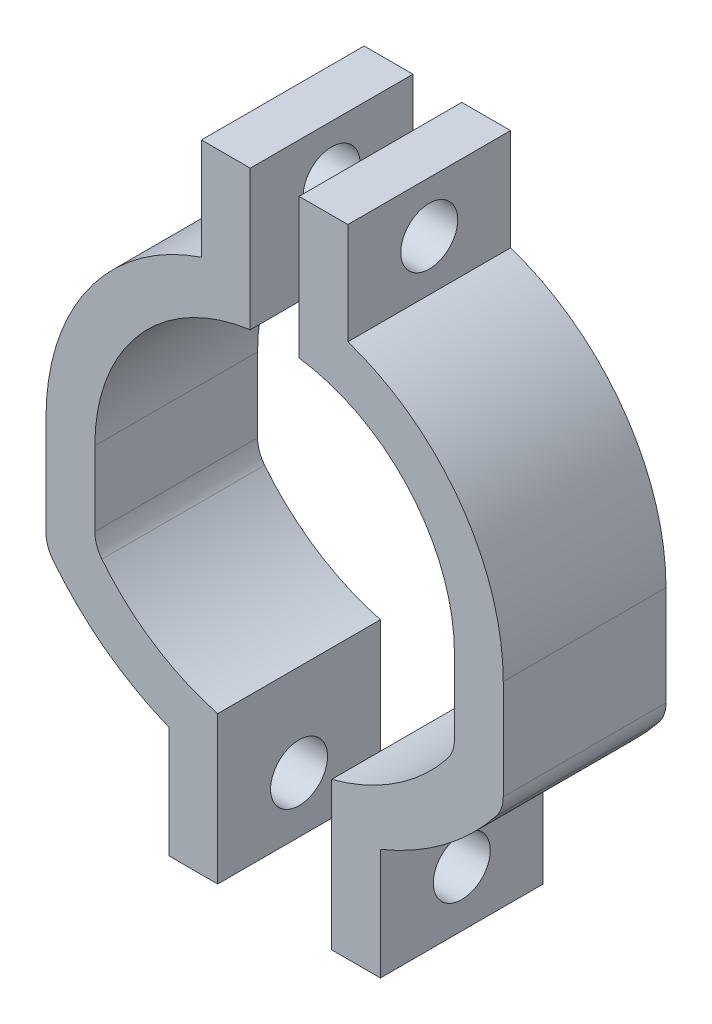
ISO-10303-21;
HEADER;
FILE_DESCRIPTION(('STEP AP214'),'2;1');
FILE_NAME('part.step','',(''),(''),'','','');
FILE_SCHEMA(('AUTOMOTIVE_DESIGN { 1 0 10303 214 1 1 1 1 }'));
ENDSEC;
DATA;
#1=APPLICATION_CONTEXT('core data for automotive mechanical design processes');
#2=APPLICATION_PROTOCOL_DEFINITION('international standard','automotive_design',2000,#1);
#3=PRODUCT_CONTEXT('',#1,'mechanical');
#4=PRODUCT('Part','Part','',(#3));
#5=PRODUCT_RELATED_PRODUCT_CATEGORY('part','',(#4));
#6=PRODUCT_DEFINITION_FORMATION('','',#4);
#7=PRODUCT_DEFINITION_CONTEXT('part definition',#1,'design');
#8=PRODUCT_DEFINITION('design','',#6,#7);
#9=PRODUCT_DEFINITION_SHAPE('','',#8);
#10=(LENGTH_UNIT() NAMED_UNIT(*) SI_UNIT(.MILLI.,.METRE.));
#11=(NAMED_UNIT(*) PLANE_ANGLE_UNIT() SI_UNIT($,.RADIAN.));
#12=(NAMED_UNIT(*) SI_UNIT($,.STERADIAN.) SOLID_ANGLE_UNIT());
#13=UNCERTAINTY_MEASURE_WITH_UNIT(LENGTH_MEASURE(1.E-05),#10,'distance_accuracy_value','');
#14=(GEOMETRIC_REPRESENTATION_CONTEXT(3) GLOBAL_UNCERTAINTY_ASSIGNED_CONTEXT((#13)) GLOBAL_UNIT_ASSIGNED_CONTEXT((#10,
#11,#12)) REPRESENTATION_CONTEXT('',''));
#15=CARTESIAN_POINT('',(0.,0.,0.));
#16=DIRECTION('',(0.,0.,1.));
#17=DIRECTION('',(1.,0.,0.));
#18=AXIS2_PLACEMENT_3D('',#15,#16,#17);
#19=CARTESIAN_POINT('',(0.,0.,10.));
#20=DIRECTION('',(0.,0.,-1.));
#21=DIRECTION('',(-1.,0.,0.));
#22=AXIS2_PLACEMENT_3D('',#19,#20,#21);
#23=CYLINDRICAL_SURFACE('',#22,14.05);
#24=CARTESIAN_POINT('',(0.,0.,0.));
#25=DIRECTION('',(0.,0.,1.));
#26=DIRECTION('',(1.,0.,0.));
#27=AXIS2_PLACEMENT_3D('',#24,#25,#26);
#28=CIRCLE('',#27,14.05);
#29=CARTESIAN_POINT('',(-4.5,13.3098647626488,0.));
#30=VERTEX_POINT('',#29);
#31=CARTESIAN_POINT('',(-14.05,0.,0.));
#32=VERTEX_POINT('',#31);
#33=EDGE_CURVE('E176',#30,#32,#28,.T.);
#34=ORIENTED_EDGE('',*,*,#33,.T.);
#35=DIRECTION('',(0.,0.,-1.));
#36=VECTOR('',#35,1.);
#37=CARTESIAN_POINT('',(-14.05,0.,10.));
#38=LINE('',#37,#36);
#39=CARTESIAN_POINT('',(-14.05,0.,10.));
#40=VERTEX_POINT('',#39);
#41=EDGE_CURVE('E12',#40,#32,#38,.T.);
#42=ORIENTED_EDGE('',*,*,#41,.F.);
#43=CARTESIAN_POINT('',(0.,0.,10.));
#44=DIRECTION('',(0.,0.,1.));
#45=DIRECTION('',(1.,0.,0.));
#46=AXIS2_PLACEMENT_3D('',#43,#44,#45);
#47=CIRCLE('',#46,14.05);
#48=CARTESIAN_POINT('',(-4.5,13.3098647626488,10.));
#49=VERTEX_POINT('',#48);
#50=EDGE_CURVE('E204',#49,#40,#47,.T.);
#51=ORIENTED_EDGE('',*,*,#50,.F.);
#52=DIRECTION('',(0.,0.,-1.));
#53=VECTOR('',#52,1.);
#54=CARTESIAN_POINT('',(-4.5,13.3098647626488,10.));
#55=LINE('',#54,#53);
#56=EDGE_CURVE('E172',#49,#30,#55,.T.);
#57=ORIENTED_EDGE('',*,*,#56,.T.);
#58=EDGE_LOOP('',(#34,#42,#51,#57));
#59=FACE_BOUND('',#58,.T.);
#60=ADVANCED_FACE('F43',(#59),#23,.T.);
#61=CARTESIAN_POINT('',(-14.05,0.,10.));
#62=DIRECTION('',(1.,0.,0.));
#63=DIRECTION('',(0.,0.,-1.));
#64=AXIS2_PLACEMENT_3D('',#61,#62,#63);
#65=PLANE('',#64);
#66=DIRECTION('',(0.,-1.,0.));
#67=VECTOR('',#66,1.);
#68=CARTESIAN_POINT('',(-14.05,0.,0.));
#69=LINE('',#68,#67);
#70=CARTESIAN_POINT('',(-14.05,-6.13172007972729,0.));
#71=VERTEX_POINT('',#70);
#72=EDGE_CURVE('E179',#32,#71,#69,.T.);
#73=ORIENTED_EDGE('',*,*,#72,.T.);
#74=DIRECTION('',(0.,0.,-1.));
#75=VECTOR('',#74,1.);
#76=CARTESIAN_POINT('',(-14.05,-6.13172007972729,10.));
#77=LINE('',#76,#75);
#78=CARTESIAN_POINT('',(-14.05,-6.13172007972729,10.));
#79=VERTEX_POINT('',#78);
#80=EDGE_CURVE('E52',#79,#71,#77,.T.);
#81=ORIENTED_EDGE('',*,*,#80,.F.);
#82=DIRECTION('',(0.,-1.,0.));
#83=VECTOR('',#82,1.);
#84=CARTESIAN_POINT('',(-14.05,0.,10.));
#85=LINE('',#84,#83);
#86=EDGE_CURVE('E121',#40,#79,#85,.T.);
#87=ORIENTED_EDGE('',*,*,#86,.F.);
#88=ORIENTED_EDGE('',*,*,#41,.T.);
#89=EDGE_LOOP('',(#73,#81,#87,#88));
#90=FACE_BOUND('',#89,.T.);
#91=ADVANCED_FACE('F295',(#90),#65,.F.);
#92=CARTESIAN_POINT('',(-12.05,-6.13172007972729,10.));
#93=DIRECTION('',(0.,0.,-1.));
#94=DIRECTION('',(-1.,0.,0.));
#95=AXIS2_PLACEMENT_3D('',#92,#93,#94);
#96=CYLINDRICAL_SURFACE('',#95,2.);
#97=CARTESIAN_POINT('',(-12.05,-6.13172007972729,0.));
#98=DIRECTION('',(0.,0.,1.));
#99=DIRECTION('',(-1.,0.,0.));
#100=AXIS2_PLACEMENT_3D('',#97,#98,#99);
#101=CIRCLE('',#100,2.);
#102=CARTESIAN_POINT('',(-13.6184776271521,-7.3726382612056,0.));
#103=VERTEX_POINT('',#102);
#104=EDGE_CURVE('E182',#71,#103,#101,.T.);
#105=ORIENTED_EDGE('',*,*,#104,.T.);
#106=DIRECTION('',(0.,0.,-1.));
#107=VECTOR('',#106,1.);
#108=CARTESIAN_POINT('',(-13.6184776271521,-7.3726382612056,10.));
#109=LINE('',#108,#107);
#110=CARTESIAN_POINT('',(-13.6184776271521,-7.3726382612056,10.));
#111=VERTEX_POINT('',#110);
#112=EDGE_CURVE('E229',#111,#103,#109,.T.);
#113=ORIENTED_EDGE('',*,*,#112,.F.);
#114=CARTESIAN_POINT('',(-12.05,-6.13172007972729,10.));
#115=DIRECTION('',(0.,0.,1.));
#116=DIRECTION('',(-1.,0.,0.));
#117=AXIS2_PLACEMENT_3D('',#114,#115,#116);
#118=CIRCLE('',#117,2.);
#119=EDGE_CURVE('E238',#79,#111,#118,.T.);
#120=ORIENTED_EDGE('',*,*,#119,.F.);
#121=ORIENTED_EDGE('',*,*,#80,.T.);
#122=EDGE_LOOP('',(#105,#113,#120,#121));
#123=FACE_BOUND('',#122,.T.);
#124=ADVANCED_FACE('F236',(#123),#96,.T.);
#125=CARTESIAN_POINT('',(0.,3.40176884479405,10.));
#126=DIRECTION('',(0.,0.,-1.));
#127=DIRECTION('',(-1.,0.,0.));
#128=AXIS2_PLACEMENT_3D('',#125,#126,#127);
#129=CYLINDRICAL_SURFACE('',#128,17.3652175732715);
#130=CARTESIAN_POINT('',(0.,3.40176884479405,0.));
#131=DIRECTION('',(0.,0.,1.));
#132=DIRECTION('',(1.,0.,0.));
#133=AXIS2_PLACEMENT_3D('',#130,#131,#132);
#134=CIRCLE('',#133,17.3652175732715);
#135=CARTESIAN_POINT('',(-6.5,-12.7010502055169,0.));
#136=VERTEX_POINT('',#135);
#137=EDGE_CURVE('E184',#103,#136,#134,.T.);
#138=ORIENTED_EDGE('',*,*,#137,.T.);
#139=DIRECTION('',(0.,0.,-1.));
#140=VECTOR('',#139,1.);
#141=CARTESIAN_POINT('',(-6.5,-12.7010502055169,10.));
#142=LINE('',#141,#140);
#143=CARTESIAN_POINT('',(-6.5,-12.7010502055169,10.));
#144=VERTEX_POINT('',#143);
#145=EDGE_CURVE('E226',#144,#136,#142,.T.);
#146=ORIENTED_EDGE('',*,*,#145,.F.);
#147=CARTESIAN_POINT('',(0.,3.40176884479405,10.));
#148=DIRECTION('',(0.,0.,1.));
#149=DIRECTION('',(1.,0.,0.));
#150=AXIS2_PLACEMENT_3D('',#147,#148,#149);
#151=CIRCLE('',#150,17.3652175732715);
#152=EDGE_CURVE('E256',#111,#144,#151,.T.);
#153=ORIENTED_EDGE('',*,*,#152,.F.);
#154=ORIENTED_EDGE('',*,*,#112,.T.);
#155=EDGE_LOOP('',(#138,#146,#153,#154));
#156=FACE_BOUND('',#155,.T.);
#157=ADVANCED_FACE('F247',(#156),#129,.T.);
#158=CARTESIAN_POINT('',(-6.5,-19.55,10.));
#159=DIRECTION('',(1.,0.,0.));
#160=DIRECTION('',(0.,0.,-1.));
#161=AXIS2_PLACEMENT_3D('',#158,#159,#160);
#162=PLANE('',#161);
#163=CARTESIAN_POINT('',(-6.5,-16.1255251027584,5.));
#164=DIRECTION('',(1.,0.,0.));
#165=DIRECTION('',(0.,0.,-1.));
#166=AXIS2_PLACEMENT_3D('',#163,#164,#165);
#167=CIRCLE('',#166,1.75);
#168=CARTESIAN_POINT('',(-6.5,-16.1255251027584,3.25));
#169=VERTEX_POINT('',#168);
#170=EDGE_CURVE('E342',#169,#169,#167,.T.);
#171=ORIENTED_EDGE('',*,*,#170,.T.);
#172=EDGE_LOOP('',(#171));
#173=FACE_BOUND('',#172,.T.);
#174=DIRECTION('',(0.,-1.,0.));
#175=VECTOR('',#174,1.);
#176=CARTESIAN_POINT('',(-6.5,-19.55,0.));
#177=LINE('',#176,#175);
#178=CARTESIAN_POINT('',(-6.5,-19.55,0.));
#179=VERTEX_POINT('',#178);
#180=EDGE_CURVE('E186',#136,#179,#177,.T.);
#181=ORIENTED_EDGE('',*,*,#180,.T.);
#182=DIRECTION('',(0.,0.,-1.));
#183=VECTOR('',#182,1.);
#184=CARTESIAN_POINT('',(-6.5,-19.55,10.));
#185=LINE('',#184,#183);
#186=CARTESIAN_POINT('',(-6.5,-19.55,10.));
#187=VERTEX_POINT('',#186);
#188=EDGE_CURVE('E223',#187,#179,#185,.T.);
#189=ORIENTED_EDGE('',*,*,#188,.F.);
#190=DIRECTION('',(0.,-1.,0.));
#191=VECTOR('',#190,1.);
#192=CARTESIAN_POINT('',(-6.5,-19.55,10.));
#193=LINE('',#192,#191);
#194=EDGE_CURVE('E253',#144,#187,#193,.T.);
#195=ORIENTED_EDGE('',*,*,#194,.F.);
#196=ORIENTED_EDGE('',*,*,#145,.T.);
#197=EDGE_LOOP('',(#181,#189,#195,#196));
#198=FACE_BOUND('',#197,.T.);
#199=ADVANCED_FACE('F251',(#173,#198),#162,.F.);
#200=CARTESIAN_POINT('',(-6.5,-19.55,10.));
#201=DIRECTION('',(0.,1.,0.));
#202=DIRECTION('',(0.,0.,1.));
#203=AXIS2_PLACEMENT_3D('',#200,#201,#202);
#204=PLANE('',#203);
#205=DIRECTION('',(1.,0.,0.));
#206=VECTOR('',#205,1.);
#207=CARTESIAN_POINT('',(-6.5,-19.55,0.));
#208=LINE('',#207,#206);
#209=CARTESIAN_POINT('',(-3.5,-19.55,0.));
#210=VERTEX_POINT('',#209);
#211=EDGE_CURVE('E188',#179,#210,#208,.T.);
#212=ORIENTED_EDGE('',*,*,#211,.T.);
#213=DIRECTION('',(0.,0.,-1.));
#214=VECTOR('',#213,1.);
#215=CARTESIAN_POINT('',(-3.5,-19.55,10.));
#216=LINE('',#215,#214);
#217=CARTESIAN_POINT('',(-3.5,-19.55,10.));
#218=VERTEX_POINT('',#217);
#219=EDGE_CURVE('E220',#218,#210,#216,.T.);
#220=ORIENTED_EDGE('',*,*,#219,.F.);
#221=DIRECTION('',(1.,0.,0.));
#222=VECTOR('',#221,1.);
#223=CARTESIAN_POINT('',(-6.5,-19.55,10.));
#224=LINE('',#223,#222);
#225=EDGE_CURVE('E255',#187,#218,#224,.T.);
#226=ORIENTED_EDGE('',*,*,#225,.F.);
#227=ORIENTED_EDGE('',*,*,#188,.T.);
#228=EDGE_LOOP('',(#212,#220,#226,#227));
#229=FACE_BOUND('',#228,.T.);
#230=ADVANCED_FACE('F308',(#229),#204,.F.);
#231=CARTESIAN_POINT('',(-3.5,-10.4810543362774,10.));
#232=DIRECTION('',(-1.,0.,0.));
#233=DIRECTION('',(0.,0.,1.));
#234=AXIS2_PLACEMENT_3D('',#231,#232,#233);
#235=PLANE('',#234);
#236=CARTESIAN_POINT('',(-3.5,-16.1255251027584,5.));
#237=DIRECTION('',(-1.,0.,0.));
#238=DIRECTION('',(0.,0.,1.));
#239=AXIS2_PLACEMENT_3D('',#236,#237,#238);
#240=CIRCLE('',#239,1.75);
#241=CARTESIAN_POINT('',(-3.5,-16.1255251027584,6.75));
#242=VERTEX_POINT('',#241);
#243=EDGE_CURVE('E46',#242,#242,#240,.T.);
#244=ORIENTED_EDGE('',*,*,#243,.T.);
#245=EDGE_LOOP('',(#244));
#246=FACE_BOUND('',#245,.T.);
#247=DIRECTION('',(0.,1.,0.));
#248=VECTOR('',#247,1.);
#249=CARTESIAN_POINT('',(-3.5,-10.4810543362774,0.));
#250=LINE('',#249,#248);
#251=CARTESIAN_POINT('',(-3.5,-10.4810543362774,0.));
#252=VERTEX_POINT('',#251);
#253=EDGE_CURVE('E191',#210,#252,#250,.T.);
#254=ORIENTED_EDGE('',*,*,#253,.T.);
#255=DIRECTION('',(0.,0.,-1.));
#256=VECTOR('',#255,1.);
#257=CARTESIAN_POINT('',(-3.5,-10.4810543362774,10.));
#258=LINE('',#257,#256);
#259=CARTESIAN_POINT('',(-3.5,-10.4810543362774,10.));
#260=VERTEX_POINT('',#259);
#261=EDGE_CURVE('E217',#260,#252,#258,.T.);
#262=ORIENTED_EDGE('',*,*,#261,.F.);
#263=DIRECTION('',(0.,1.,0.));
#264=VECTOR('',#263,1.);
#265=CARTESIAN_POINT('',(-3.5,-19.55,10.));
#266=LINE('',#265,#264);
#267=EDGE_CURVE('E258',#218,#260,#266,.T.);
#268=ORIENTED_EDGE('',*,*,#267,.F.);
#269=ORIENTED_EDGE('',*,*,#219,.T.);
#270=EDGE_LOOP('',(#254,#262,#268,#269));
#271=FACE_BOUND('',#270,.T.);
#272=ADVANCED_FACE('F312',(#246,#271),#235,.F.);
#273=CARTESIAN_POINT('',(0.,2.62026358686128,10.));
#274=DIRECTION('',(0.,0.,-1.));
#275=DIRECTION('',(-1.,0.,0.));
#276=AXIS2_PLACEMENT_3D('',#273,#274,#275);
#277=CYLINDRICAL_SURFACE('',#276,13.5607717819878);
#278=CARTESIAN_POINT('',(0.,2.62026358686128,0.));
#279=DIRECTION('',(0.,0.,-1.));
#280=DIRECTION('',(1.,0.,0.));
#281=AXIS2_PLACEMENT_3D('',#278,#279,#280);
#282=CIRCLE('',#281,13.5607717819878);
#283=CARTESIAN_POINT('',(-10.6156394176209,-5.81790748738272,0.));
#284=VERTEX_POINT('',#283);
#285=EDGE_CURVE('E193',#252,#284,#282,.T.);
#286=ORIENTED_EDGE('',*,*,#285,.T.);
#287=DIRECTION('',(0.,0.,-1.));
#288=VECTOR('',#287,1.);
#289=CARTESIAN_POINT('',(-10.6156394176209,-5.81790748738272,10.));
#290=LINE('',#289,#288);
#291=CARTESIAN_POINT('',(-10.6156394176209,-5.81790748738272,10.));
#292=VERTEX_POINT('',#291);
#293=EDGE_CURVE('E214',#292,#284,#290,.T.);
#294=ORIENTED_EDGE('',*,*,#293,.F.);
#295=CARTESIAN_POINT('',(0.,2.62026358686128,10.));
#296=DIRECTION('',(0.,0.,-1.));
#297=DIRECTION('',(1.,0.,0.));
#298=AXIS2_PLACEMENT_3D('',#295,#296,#297);
#299=CIRCLE('',#298,13.5607717819878);
#300=EDGE_CURVE('E264',#260,#292,#299,.T.);
#301=ORIENTED_EDGE('',*,*,#300,.F.);
#302=ORIENTED_EDGE('',*,*,#261,.T.);
#303=EDGE_LOOP('',(#286,#294,#301,#302));
#304=FACE_BOUND('',#303,.T.);
#305=ADVANCED_FACE('F316',(#304),#277,.F.);
#306=CARTESIAN_POINT('',(-9.05,-4.57341031422742,10.));
#307=DIRECTION('',(0.,0.,-1.));
#308=DIRECTION('',(-1.,0.,0.));
#309=AXIS2_PLACEMENT_3D('',#306,#307,#308);
#310=CYLINDRICAL_SURFACE('',#309,2.);
#311=CARTESIAN_POINT('',(-9.05,-4.57341031422742,0.));
#312=DIRECTION('',(0.,0.,-1.));
#313=DIRECTION('',(-1.,0.,0.));
#314=AXIS2_PLACEMENT_3D('',#311,#312,#313);
#315=CIRCLE('',#314,2.);
#316=CARTESIAN_POINT('',(-11.05,-4.57341031422742,0.));
#317=VERTEX_POINT('',#316);
#318=EDGE_CURVE('E195',#284,#317,#315,.T.);
#319=ORIENTED_EDGE('',*,*,#318,.T.);
#320=DIRECTION('',(0.,0.,-1.));
#321=VECTOR('',#320,1.);
#322=CARTESIAN_POINT('',(-11.05,-4.57341031422742,10.));
#323=LINE('',#322,#321);
#324=CARTESIAN_POINT('',(-11.05,-4.57341031422742,10.));
#325=VERTEX_POINT('',#324);
#326=EDGE_CURVE('E211',#325,#317,#323,.T.);
#327=ORIENTED_EDGE('',*,*,#326,.F.);
#328=CARTESIAN_POINT('',(-9.05,-4.57341031422742,10.));
#329=DIRECTION('',(0.,0.,-1.));
#330=DIRECTION('',(-1.,0.,0.));
#331=AXIS2_PLACEMENT_3D('',#328,#329,#330);
#332=CIRCLE('',#331,2.);
#333=EDGE_CURVE('E266',#292,#325,#332,.T.);
#334=ORIENTED_EDGE('',*,*,#333,.F.);
#335=ORIENTED_EDGE('',*,*,#293,.T.);
#336=EDGE_LOOP('',(#319,#327,#334,#335));
#337=FACE_BOUND('',#336,.T.);
#338=ADVANCED_FACE('F320',(#337),#310,.F.);
#339=CARTESIAN_POINT('',(-11.05,0.,10.));
#340=DIRECTION('',(-1.,0.,0.));
#341=DIRECTION('',(0.,0.,1.));
#342=AXIS2_PLACEMENT_3D('',#339,#340,#341);
#343=PLANE('',#342);
#344=DIRECTION('',(0.,1.,0.));
#345=VECTOR('',#344,1.);
#346=CARTESIAN_POINT('',(-11.05,0.,0.));
#347=LINE('',#346,#345);
#348=CARTESIAN_POINT('',(-11.05,0.,0.));
#349=VERTEX_POINT('',#348);
#350=EDGE_CURVE('E197',#317,#349,#347,.T.);
#351=ORIENTED_EDGE('',*,*,#350,.T.);
#352=DIRECTION('',(0.,0.,-1.));
#353=VECTOR('',#352,1.);
#354=CARTESIAN_POINT('',(-11.05,0.,10.));
#355=LINE('',#354,#353);
#356=CARTESIAN_POINT('',(-11.05,0.,10.));
#357=VERTEX_POINT('',#356);
#358=EDGE_CURVE('E208',#357,#349,#355,.T.);
#359=ORIENTED_EDGE('',*,*,#358,.F.);
#360=DIRECTION('',(0.,1.,0.));
#361=VECTOR('',#360,1.);
#362=CARTESIAN_POINT('',(-11.05,0.,10.));
#363=LINE('',#362,#361);
#364=EDGE_CURVE('E268',#325,#357,#363,.T.);
#365=ORIENTED_EDGE('',*,*,#364,.F.);
#366=ORIENTED_EDGE('',*,*,#326,.T.);
#367=EDGE_LOOP('',(#351,#359,#365,#366));
#368=FACE_BOUND('',#367,.T.);
#369=ADVANCED_FACE('F274',(#368),#343,.F.);
#370=CARTESIAN_POINT('',(0.,0.,10.));
#371=DIRECTION('',(0.,0.,-1.));
#372=DIRECTION('',(-1.,0.,0.));
#373=AXIS2_PLACEMENT_3D('',#370,#371,#372);
#374=CYLINDRICAL_SURFACE('',#373,11.05);
#375=CARTESIAN_POINT('',(0.,0.,0.));
#376=DIRECTION('',(0.,0.,-1.));
#377=DIRECTION('',(1.,0.,0.));
#378=AXIS2_PLACEMENT_3D('',#375,#376,#377);
#379=CIRCLE('',#378,11.05);
#380=CARTESIAN_POINT('',(-1.5,10.9477166569107,0.));
#381=VERTEX_POINT('',#380);
#382=EDGE_CURVE('E199',#349,#381,#379,.T.);
#383=ORIENTED_EDGE('',*,*,#382,.T.);
#384=DIRECTION('',(0.,0.,-1.));
#385=VECTOR('',#384,1.);
#386=CARTESIAN_POINT('',(-1.5,10.9477166569107,10.));
#387=LINE('',#386,#385);
#388=CARTESIAN_POINT('',(-1.5,10.9477166569107,10.));
#389=VERTEX_POINT('',#388);
#390=EDGE_CURVE('E167',#389,#381,#387,.T.);
#391=ORIENTED_EDGE('',*,*,#390,.F.);
#392=CARTESIAN_POINT('',(0.,0.,10.));
#393=DIRECTION('',(0.,0.,-1.));
#394=DIRECTION('',(1.,0.,0.));
#395=AXIS2_PLACEMENT_3D('',#392,#393,#394);
#396=CIRCLE('',#395,11.05);
#397=EDGE_CURVE('E158',#357,#389,#396,.T.);
#398=ORIENTED_EDGE('',*,*,#397,.F.);
#399=ORIENTED_EDGE('',*,*,#358,.T.);
#400=EDGE_LOOP('',(#383,#391,#398,#399));
#401=FACE_BOUND('',#400,.T.);
#402=ADVANCED_FACE('F278',(#401),#374,.F.);
#403=CARTESIAN_POINT('',(-1.5,19.55,10.));
#404=DIRECTION('',(-1.,0.,0.));
#405=DIRECTION('',(0.,0.,1.));
#406=AXIS2_PLACEMENT_3D('',#403,#404,#405);
#407=PLANE('',#406);
#408=CARTESIAN_POINT('',(-1.5,16.4299323813244,5.));
#409=DIRECTION('',(-1.,0.,0.));
#410=DIRECTION('',(0.,0.,1.));
#411=AXIS2_PLACEMENT_3D('',#408,#409,#410);
#412=CIRCLE('',#411,1.75);
#413=CARTESIAN_POINT('',(-1.5,16.4299323813244,6.75));
#414=VERTEX_POINT('',#413);
#415=EDGE_CURVE('E180',#414,#414,#412,.T.);
#416=ORIENTED_EDGE('',*,*,#415,.T.);
#417=EDGE_LOOP('',(#416));
#418=FACE_BOUND('',#417,.T.);
#419=DIRECTION('',(0.,1.,0.));
#420=VECTOR('',#419,1.);
#421=CARTESIAN_POINT('',(-1.5,19.55,0.));
#422=LINE('',#421,#420);
#423=CARTESIAN_POINT('',(-1.5,19.55,0.));
#424=VERTEX_POINT('',#423);
#425=EDGE_CURVE('E166',#381,#424,#422,.T.);
#426=ORIENTED_EDGE('',*,*,#425,.T.);
#427=DIRECTION('',(0.,0.,-1.));
#428=VECTOR('',#427,1.);
#429=CARTESIAN_POINT('',(-1.5,19.55,10.));
#430=LINE('',#429,#428);
#431=CARTESIAN_POINT('',(-1.5,19.55,10.));
#432=VERTEX_POINT('',#431);
#433=EDGE_CURVE('E163',#432,#424,#430,.T.);
#434=ORIENTED_EDGE('',*,*,#433,.F.);
#435=DIRECTION('',(0.,1.,0.));
#436=VECTOR('',#435,1.);
#437=CARTESIAN_POINT('',(-1.5,19.55,10.));
#438=LINE('',#437,#436);
#439=EDGE_CURVE('E152',#389,#432,#438,.T.);
#440=ORIENTED_EDGE('',*,*,#439,.F.);
#441=ORIENTED_EDGE('',*,*,#390,.T.);
#442=EDGE_LOOP('',(#426,#434,#440,#441));
#443=FACE_BOUND('',#442,.T.);
#444=ADVANCED_FACE('F164',(#418,#443),#407,.F.);
#445=CARTESIAN_POINT('',(-1.5,19.55,10.));
#446=DIRECTION('',(0.,-1.,0.));
#447=DIRECTION('',(0.,0.,-1.));
#448=AXIS2_PLACEMENT_3D('',#445,#446,#447);
#449=PLANE('',#448);
#450=DIRECTION('',(-1.,0.,0.));
#451=VECTOR('',#450,1.);
#452=CARTESIAN_POINT('',(-1.5,19.55,0.));
#453=LINE('',#452,#451);
#454=CARTESIAN_POINT('',(-4.5,19.55,0.));
#455=VERTEX_POINT('',#454);
#456=EDGE_CURVE('E107',#424,#455,#453,.T.);
#457=ORIENTED_EDGE('',*,*,#456,.T.);
#458=DIRECTION('',(0.,0.,-1.));
#459=VECTOR('',#458,1.);
#460=CARTESIAN_POINT('',(-4.5,19.55,10.));
#461=LINE('',#460,#459);
#462=CARTESIAN_POINT('',(-4.5,19.55,10.));
#463=VERTEX_POINT('',#462);
#464=EDGE_CURVE('E168',#463,#455,#461,.T.);
#465=ORIENTED_EDGE('',*,*,#464,.F.);
#466=DIRECTION('',(-1.,0.,0.));
#467=VECTOR('',#466,1.);
#468=CARTESIAN_POINT('',(-1.5,19.55,10.));
#469=LINE('',#468,#467);
#470=EDGE_CURVE('E156',#432,#463,#469,.T.);
#471=ORIENTED_EDGE('',*,*,#470,.F.);
#472=ORIENTED_EDGE('',*,*,#433,.T.);
#473=EDGE_LOOP('',(#457,#465,#471,#472));
#474=FACE_BOUND('',#473,.T.);
#475=ADVANCED_FACE('F170',(#474),#449,.F.);
#476=CARTESIAN_POINT('',(-4.5,19.55,10.));
#477=DIRECTION('',(1.,0.,0.));
#478=DIRECTION('',(0.,0.,-1.));
#479=AXIS2_PLACEMENT_3D('',#476,#477,#478);
#480=PLANE('',#479);
#481=CARTESIAN_POINT('',(-4.5,16.4299323813244,5.));
#482=DIRECTION('',(1.,0.,0.));
#483=DIRECTION('',(0.,0.,-1.));
#484=AXIS2_PLACEMENT_3D('',#481,#482,#483);
#485=CIRCLE('',#484,1.75);
#486=CARTESIAN_POINT('',(-4.5,16.4299323813244,3.25));
#487=VERTEX_POINT('',#486);
#488=EDGE_CURVE('E336',#487,#487,#485,.T.);
#489=ORIENTED_EDGE('',*,*,#488,.T.);
#490=EDGE_LOOP('',(#489));
#491=FACE_BOUND('',#490,.T.);
#492=DIRECTION('',(0.,-1.,0.));
#493=VECTOR('',#492,1.);
#494=CARTESIAN_POINT('',(-4.5,19.55,0.));
#495=LINE('',#494,#493);
#496=EDGE_CURVE('E113',#455,#30,#495,.T.);
#497=ORIENTED_EDGE('',*,*,#496,.T.);
#498=ORIENTED_EDGE('',*,*,#56,.F.);
#499=DIRECTION('',(0.,-1.,0.));
#500=VECTOR('',#499,1.);
#501=CARTESIAN_POINT('',(-4.5,19.55,10.));
#502=LINE('',#501,#500);
#503=EDGE_CURVE('E60',#463,#49,#502,.T.);
#504=ORIENTED_EDGE('',*,*,#503,.F.);
#505=ORIENTED_EDGE('',*,*,#464,.T.);
#506=EDGE_LOOP('',(#497,#498,#504,#505));
#507=FACE_BOUND('',#506,.T.);
#508=ADVANCED_FACE('F282',(#491,#507),#480,.F.);
#509=CARTESIAN_POINT('',(0.,0.,10.));
#510=DIRECTION('',(0.,0.,1.));
#511=DIRECTION('',(1.,0.,0.));
#512=AXIS2_PLACEMENT_3D('',#509,#510,#511);
#513=PLANE('',#512);
#514=ORIENTED_EDGE('',*,*,#50,.T.);
#515=ORIENTED_EDGE('',*,*,#86,.T.);
#516=ORIENTED_EDGE('',*,*,#119,.T.);
#517=ORIENTED_EDGE('',*,*,#152,.T.);
#518=ORIENTED_EDGE('',*,*,#194,.T.);
#519=ORIENTED_EDGE('',*,*,#225,.T.);
#520=ORIENTED_EDGE('',*,*,#267,.T.);
#521=ORIENTED_EDGE('',*,*,#300,.T.);
#522=ORIENTED_EDGE('',*,*,#333,.T.);
#523=ORIENTED_EDGE('',*,*,#364,.T.);
#524=ORIENTED_EDGE('',*,*,#397,.T.);
#525=ORIENTED_EDGE('',*,*,#439,.T.);
#526=ORIENTED_EDGE('',*,*,#470,.T.);
#527=ORIENTED_EDGE('',*,*,#503,.T.);
#528=EDGE_LOOP('',(#514,#515,#516,#517,#518,#519,#520,#521,#522,#523,#524,#525,#526,#527));
#529=FACE_BOUND('',#528,.T.);
#530=ADVANCED_FACE('F154',(#529),#513,.T.);
#531=CARTESIAN_POINT('',(0.,0.,0.));
#532=DIRECTION('',(0.,0.,1.));
#533=DIRECTION('',(1.,0.,0.));
#534=AXIS2_PLACEMENT_3D('',#531,#532,#533);
#535=PLANE('',#534);
#536=ORIENTED_EDGE('',*,*,#33,.F.);
#537=ORIENTED_EDGE('',*,*,#496,.F.);
#538=ORIENTED_EDGE('',*,*,#456,.F.);
#539=ORIENTED_EDGE('',*,*,#425,.F.);
#540=ORIENTED_EDGE('',*,*,#382,.F.);
#541=ORIENTED_EDGE('',*,*,#350,.F.);
#542=ORIENTED_EDGE('',*,*,#318,.F.);
#543=ORIENTED_EDGE('',*,*,#285,.F.);
#544=ORIENTED_EDGE('',*,*,#253,.F.);
#545=ORIENTED_EDGE('',*,*,#211,.F.);
#546=ORIENTED_EDGE('',*,*,#180,.F.);
#547=ORIENTED_EDGE('',*,*,#137,.F.);
#548=ORIENTED_EDGE('',*,*,#104,.F.);
#549=ORIENTED_EDGE('',*,*,#72,.F.);
#550=EDGE_LOOP('',(#536,#537,#538,#539,#540,#541,#542,#543,#544,#545,#546,#547,#548,#549));
#551=FACE_BOUND('',#550,.T.);
#552=ADVANCED_FACE('F242',(#551),#535,.F.);
#553=CARTESIAN_POINT('',(-4.5,16.4299323813244,5.));
#554=DIRECTION('',(1.,0.,0.));
#555=DIRECTION('',(0.,0.,-1.));
#556=AXIS2_PLACEMENT_3D('',#553,#554,#555);
#557=CYLINDRICAL_SURFACE('',#556,1.75);
#558=ORIENTED_EDGE('',*,*,#488,.F.);
#559=EDGE_LOOP('',(#558));
#560=FACE_BOUND('',#559,.T.);
#561=ORIENTED_EDGE('',*,*,#415,.F.);
#562=EDGE_LOOP('',(#561));
#563=FACE_BOUND('',#562,.T.);
#564=ADVANCED_FACE('F351',(#560,#563),#557,.F.);
#565=CARTESIAN_POINT('',(-6.5,-16.1255251027584,5.));
#566=DIRECTION('',(1.,0.,0.));
#567=DIRECTION('',(0.,0.,-1.));
#568=AXIS2_PLACEMENT_3D('',#565,#566,#567);
#569=CYLINDRICAL_SURFACE('',#568,1.75);
#570=ORIENTED_EDGE('',*,*,#170,.F.);
#571=EDGE_LOOP('',(#570));
#572=FACE_BOUND('',#571,.T.);
#573=ORIENTED_EDGE('',*,*,#243,.F.);
#574=EDGE_LOOP('',(#573));
#575=FACE_BOUND('',#574,.T.);
#576=ADVANCED_FACE('F349',(#572,#575),#569,.F.);
#577=CLOSED_SHELL('',(#60,#91,#124,#157,#199,#230,#272,#305,#338,#369,#402,#444,#475,#508,#530,
#552,#564,#576));
#578=MANIFOLD_SOLID_BREP('B2',#577);
#579=CARTESIAN_POINT('',(0.,0.,10.));
#580=DIRECTION('',(0.,0.,-1.));
#581=DIRECTION('',(-1.,0.,0.));
#582=AXIS2_PLACEMENT_3D('',#579,#580,#581);
#583=CYLINDRICAL_SURFACE('',#582,11.05);
#584=CARTESIAN_POINT('',(0.,0.,0.));
#585=DIRECTION('',(0.,0.,-1.));
#586=DIRECTION('',(1.,0.,0.));
#587=AXIS2_PLACEMENT_3D('',#584,#585,#586);
#588=CIRCLE('',#587,11.05);
#589=CARTESIAN_POINT('',(1.5,10.9477166569107,0.));
#590=VERTEX_POINT('',#589);
#591=CARTESIAN_POINT('',(11.05,0.,0.));
#592=VERTEX_POINT('',#591);
#593=EDGE_CURVE('E605',#590,#592,#588,.T.);
#594=ORIENTED_EDGE('',*,*,#593,.T.);
#595=DIRECTION('',(0.,0.,-1.));
#596=VECTOR('',#595,1.);
#597=CARTESIAN_POINT('',(11.05,0.,10.));
#598=LINE('',#597,#596);
#599=CARTESIAN_POINT('',(11.05,0.,10.));
#600=VERTEX_POINT('',#599);
#601=EDGE_CURVE('E41',#600,#592,#598,.T.);
#602=ORIENTED_EDGE('',*,*,#601,.F.);
#603=CARTESIAN_POINT('',(0.,0.,10.));
#604=DIRECTION('',(0.,0.,-1.));
#605=DIRECTION('',(1.,0.,0.));
#606=AXIS2_PLACEMENT_3D('',#603,#604,#605);
#607=CIRCLE('',#606,11.05);
#608=CARTESIAN_POINT('',(1.5,10.9477166569107,10.));
#609=VERTEX_POINT('',#608);
#610=EDGE_CURVE('E632',#609,#600,#607,.T.);
#611=ORIENTED_EDGE('',*,*,#610,.F.);
#612=DIRECTION('',(0.,0.,-1.));
#613=VECTOR('',#612,1.);
#614=CARTESIAN_POINT('',(1.5,10.9477166569107,10.));
#615=LINE('',#614,#613);
#616=EDGE_CURVE('E601',#609,#590,#615,.T.);
#617=ORIENTED_EDGE('',*,*,#616,.T.);
#618=EDGE_LOOP('',(#594,#602,#611,#617));
#619=FACE_BOUND('',#618,.T.);
#620=ADVANCED_FACE('F472',(#619),#583,.F.);
#621=CARTESIAN_POINT('',(11.05,0.,10.));
#622=DIRECTION('',(1.,0.,0.));
#623=DIRECTION('',(0.,1.,0.));
#624=AXIS2_PLACEMENT_3D('',#621,#622,#623);
#625=PLANE('',#624);
#626=DIRECTION('',(0.,-1.,0.));
#627=VECTOR('',#626,1.);
#628=CARTESIAN_POINT('',(11.05,0.,0.));
#629=LINE('',#628,#627);
#630=CARTESIAN_POINT('',(11.05,-4.57341031422742,0.));
#631=VERTEX_POINT('',#630);
#632=EDGE_CURVE('E608',#592,#631,#629,.T.);
#633=ORIENTED_EDGE('',*,*,#632,.T.);
#634=DIRECTION('',(0.,0.,-1.));
#635=VECTOR('',#634,1.);
#636=CARTESIAN_POINT('',(11.05,-4.57341031422742,10.));
#637=LINE('',#636,#635);
#638=CARTESIAN_POINT('',(11.05,-4.57341031422742,10.));
#639=VERTEX_POINT('',#638);
#640=EDGE_CURVE('E481',#639,#631,#637,.T.);
#641=ORIENTED_EDGE('',*,*,#640,.F.);
#642=DIRECTION('',(0.,-1.,0.));
#643=VECTOR('',#642,1.);
#644=CARTESIAN_POINT('',(11.05,0.,10.));
#645=LINE('',#644,#643);
#646=EDGE_CURVE('E550',#600,#639,#645,.T.);
#647=ORIENTED_EDGE('',*,*,#646,.F.);
#648=ORIENTED_EDGE('',*,*,#601,.T.);
#649=EDGE_LOOP('',(#633,#641,#647,#648));
#650=FACE_BOUND('',#649,.T.);
#651=ADVANCED_FACE('F722',(#650),#625,.F.);
#652=CARTESIAN_POINT('',(9.05,-4.57341031422742,10.));
#653=DIRECTION('',(0.,0.,-1.));
#654=DIRECTION('',(-1.,0.,0.));
#655=AXIS2_PLACEMENT_3D('',#652,#653,#654);
#656=CYLINDRICAL_SURFACE('',#655,2.);
#657=CARTESIAN_POINT('',(9.05,-4.57341031422742,0.));
#658=DIRECTION('',(0.,0.,-1.));
#659=DIRECTION('',(1.,0.,0.));
#660=AXIS2_PLACEMENT_3D('',#657,#658,#659);
#661=CIRCLE('',#660,2.);
#662=CARTESIAN_POINT('',(10.6156394176209,-5.81790748738272,0.));
#663=VERTEX_POINT('',#662);
#664=EDGE_CURVE('E610',#631,#663,#661,.T.);
#665=ORIENTED_EDGE('',*,*,#664,.T.);
#666=DIRECTION('',(0.,0.,-1.));
#667=VECTOR('',#666,1.);
#668=CARTESIAN_POINT('',(10.6156394176209,-5.81790748738272,10.));
#669=LINE('',#668,#667);
#670=CARTESIAN_POINT('',(10.6156394176209,-5.81790748738272,10.));
#671=VERTEX_POINT('',#670);
#672=EDGE_CURVE('E657',#671,#663,#669,.T.);
#673=ORIENTED_EDGE('',*,*,#672,.F.);
#674=CARTESIAN_POINT('',(9.05,-4.57341031422742,10.));
#675=DIRECTION('',(0.,0.,-1.));
#676=DIRECTION('',(1.,0.,0.));
#677=AXIS2_PLACEMENT_3D('',#674,#675,#676);
#678=CIRCLE('',#677,2.);
#679=EDGE_CURVE('E666',#639,#671,#678,.T.);
#680=ORIENTED_EDGE('',*,*,#679,.F.);
#681=ORIENTED_EDGE('',*,*,#640,.T.);
#682=EDGE_LOOP('',(#665,#673,#680,#681));
#683=FACE_BOUND('',#682,.T.);
#684=ADVANCED_FACE('F664',(#683),#656,.F.);
#685=CARTESIAN_POINT('',(0.,2.62026358686128,10.));
#686=DIRECTION('',(0.,0.,-1.));
#687=DIRECTION('',(-1.,0.,0.));
#688=AXIS2_PLACEMENT_3D('',#685,#686,#687);
#689=CYLINDRICAL_SURFACE('',#688,13.5607717819878);
#690=CARTESIAN_POINT('',(0.,2.62026358686128,0.));
#691=DIRECTION('',(0.,0.,-1.));
#692=DIRECTION('',(-1.,0.,0.));
#693=AXIS2_PLACEMENT_3D('',#690,#691,#692);
#694=CIRCLE('',#693,13.5607717819878);
#695=CARTESIAN_POINT('',(3.50000000000001,-10.4810543362774,0.));
#696=VERTEX_POINT('',#695);
#697=EDGE_CURVE('E612',#663,#696,#694,.T.);
#698=ORIENTED_EDGE('',*,*,#697,.T.);
#699=DIRECTION('',(0.,0.,-1.));
#700=VECTOR('',#699,1.);
#701=CARTESIAN_POINT('',(3.50000000000001,-10.4810543362774,10.));
#702=LINE('',#701,#700);
#703=CARTESIAN_POINT('',(3.50000000000001,-10.4810543362774,10.));
#704=VERTEX_POINT('',#703);
#705=EDGE_CURVE('E654',#704,#696,#702,.T.);
#706=ORIENTED_EDGE('',*,*,#705,.F.);
#707=CARTESIAN_POINT('',(0.,2.62026358686128,10.));
#708=DIRECTION('',(0.,0.,-1.));
#709=DIRECTION('',(-1.,0.,0.));
#710=AXIS2_PLACEMENT_3D('',#707,#708,#709);
#711=CIRCLE('',#710,13.5607717819878);
#712=EDGE_CURVE('E683',#671,#704,#711,.T.);
#713=ORIENTED_EDGE('',*,*,#712,.F.);
#714=ORIENTED_EDGE('',*,*,#672,.T.);
#715=EDGE_LOOP('',(#698,#706,#713,#714));
#716=FACE_BOUND('',#715,.T.);
#717=ADVANCED_FACE('F674',(#716),#689,.F.);
#718=CARTESIAN_POINT('',(3.5,-19.55,10.));
#719=DIRECTION('',(1.,0.,0.));
#720=DIRECTION('',(0.,0.,-1.));
#721=AXIS2_PLACEMENT_3D('',#718,#719,#720);
#722=PLANE('',#721);
#723=CARTESIAN_POINT('',(3.5,-16.1255251027584,5.));
#724=DIRECTION('',(1.,0.,0.));
#725=DIRECTION('',(0.,0.,-1.));
#726=AXIS2_PLACEMENT_3D('',#723,#724,#725);
#727=CIRCLE('',#726,1.75);
#728=CARTESIAN_POINT('',(3.5,-16.1255251027584,3.25));
#729=VERTEX_POINT('',#728);
#730=EDGE_CURVE('E764',#729,#729,#727,.T.);
#731=ORIENTED_EDGE('',*,*,#730,.T.);
#732=EDGE_LOOP('',(#731));
#733=FACE_BOUND('',#732,.T.);
#734=DIRECTION('',(0.,-1.,0.));
#735=VECTOR('',#734,1.);
#736=CARTESIAN_POINT('',(3.5,-19.55,0.));
#737=LINE('',#736,#735);
#738=CARTESIAN_POINT('',(3.5,-19.55,0.));
#739=VERTEX_POINT('',#738);
#740=EDGE_CURVE('E615',#696,#739,#737,.T.);
#741=ORIENTED_EDGE('',*,*,#740,.T.);
#742=DIRECTION('',(0.,0.,-1.));
#743=VECTOR('',#742,1.);
#744=CARTESIAN_POINT('',(3.5,-19.55,10.));
#745=LINE('',#744,#743);
#746=CARTESIAN_POINT('',(3.5,-19.55,10.));
#747=VERTEX_POINT('',#746);
#748=EDGE_CURVE('E651',#747,#739,#745,.T.);
#749=ORIENTED_EDGE('',*,*,#748,.F.);
#750=DIRECTION('',(0.,-1.,0.));
#751=VECTOR('',#750,1.);
#752=CARTESIAN_POINT('',(3.5,-10.4810543362774,10.));
#753=LINE('',#752,#751);
#754=EDGE_CURVE('E680',#704,#747,#753,.T.);
#755=ORIENTED_EDGE('',*,*,#754,.F.);
#756=ORIENTED_EDGE('',*,*,#705,.T.);
#757=EDGE_LOOP('',(#741,#749,#755,#756));
#758=FACE_BOUND('',#757,.T.);
#759=ADVANCED_FACE('F678',(#733,#758),#722,.F.);
#760=CARTESIAN_POINT('',(3.5,-19.55,10.));
#761=DIRECTION('',(0.,1.,0.));
#762=DIRECTION('',(-1.,0.,0.));
#763=AXIS2_PLACEMENT_3D('',#760,#761,#762);
#764=PLANE('',#763);
#765=DIRECTION('',(1.,0.,0.));
#766=VECTOR('',#765,1.);
#767=CARTESIAN_POINT('',(3.5,-19.55,0.));
#768=LINE('',#767,#766);
#769=CARTESIAN_POINT('',(6.5,-19.55,0.));
#770=VERTEX_POINT('',#769);
#771=EDGE_CURVE('E617',#739,#770,#768,.T.);
#772=ORIENTED_EDGE('',*,*,#771,.T.);
#773=DIRECTION('',(0.,0.,-1.));
#774=VECTOR('',#773,1.);
#775=CARTESIAN_POINT('',(6.5,-19.55,10.));
#776=LINE('',#775,#774);
#777=CARTESIAN_POINT('',(6.5,-19.55,10.));
#778=VERTEX_POINT('',#777);
#779=EDGE_CURVE('E648',#778,#770,#776,.T.);
#780=ORIENTED_EDGE('',*,*,#779,.F.);
#781=DIRECTION('',(1.,0.,0.));
#782=VECTOR('',#781,1.);
#783=CARTESIAN_POINT('',(3.5,-19.55,10.));
#784=LINE('',#783,#782);
#785=EDGE_CURVE('E682',#747,#778,#784,.T.);
#786=ORIENTED_EDGE('',*,*,#785,.F.);
#787=ORIENTED_EDGE('',*,*,#748,.T.);
#788=EDGE_LOOP('',(#772,#780,#786,#787));
#789=FACE_BOUND('',#788,.T.);
#790=ADVANCED_FACE('F735',(#789),#764,.F.);
#791=CARTESIAN_POINT('',(6.5,-19.55,10.));
#792=DIRECTION('',(-1.,0.,0.));
#793=DIRECTION('',(0.,0.,1.));
#794=AXIS2_PLACEMENT_3D('',#791,#792,#793);
#795=PLANE('',#794);
#796=CARTESIAN_POINT('',(6.5,-16.1255251027584,5.));
#797=DIRECTION('',(1.,0.,0.));
#798=DIRECTION('',(0.,0.,-1.));
#799=AXIS2_PLACEMENT_3D('',#796,#797,#798);
#800=CIRCLE('',#799,1.75);
#801=CARTESIAN_POINT('',(6.5,-16.1255251027584,3.25));
#802=VERTEX_POINT('',#801);
#803=EDGE_CURVE('E767',#802,#802,#800,.T.);
#804=ORIENTED_EDGE('',*,*,#803,.F.);
#805=EDGE_LOOP('',(#804));
#806=FACE_BOUND('',#805,.T.);
#807=DIRECTION('',(0.,1.,0.));
#808=VECTOR('',#807,1.);
#809=CARTESIAN_POINT('',(6.5,-19.55,0.));
#810=LINE('',#809,#808);
#811=CARTESIAN_POINT('',(6.5,-12.7010502055169,0.));
#812=VERTEX_POINT('',#811);
#813=EDGE_CURVE('E619',#770,#812,#810,.T.);
#814=ORIENTED_EDGE('',*,*,#813,.T.);
#815=DIRECTION('',(0.,0.,-1.));
#816=VECTOR('',#815,1.);
#817=CARTESIAN_POINT('',(6.5,-12.7010502055169,10.));
#818=LINE('',#817,#816);
#819=CARTESIAN_POINT('',(6.5,-12.7010502055169,10.));
#820=VERTEX_POINT('',#819);
#821=EDGE_CURVE('E645',#820,#812,#818,.T.);
#822=ORIENTED_EDGE('',*,*,#821,.F.);
#823=DIRECTION('',(0.,1.,0.));
#824=VECTOR('',#823,1.);
#825=CARTESIAN_POINT('',(6.5,-19.55,10.));
#826=LINE('',#825,#824);
#827=EDGE_CURVE('E685',#778,#820,#826,.T.);
#828=ORIENTED_EDGE('',*,*,#827,.F.);
#829=ORIENTED_EDGE('',*,*,#779,.T.);
#830=EDGE_LOOP('',(#814,#822,#828,#829));
#831=FACE_BOUND('',#830,.T.);
#832=ADVANCED_FACE('F739',(#806,#831),#795,.F.);
#833=CARTESIAN_POINT('',(0.,3.40176884479405,10.));
#834=DIRECTION('',(0.,0.,-1.));
#835=DIRECTION('',(-1.,0.,0.));
#836=AXIS2_PLACEMENT_3D('',#833,#834,#835);
#837=CYLINDRICAL_SURFACE('',#836,17.3652175732715);
#838=CARTESIAN_POINT('',(0.,3.40176884479405,0.));
#839=DIRECTION('',(0.,0.,1.));
#840=DIRECTION('',(-1.,0.,0.));
#841=AXIS2_PLACEMENT_3D('',#838,#839,#840);
#842=CIRCLE('',#841,17.3652175732715);
#843=CARTESIAN_POINT('',(13.6184776271521,-7.3726382612056,0.));
#844=VERTEX_POINT('',#843);
#845=EDGE_CURVE('E621',#812,#844,#842,.T.);
#846=ORIENTED_EDGE('',*,*,#845,.T.);
#847=DIRECTION('',(0.,0.,-1.));
#848=VECTOR('',#847,1.);
#849=CARTESIAN_POINT('',(13.6184776271521,-7.3726382612056,10.));
#850=LINE('',#849,#848);
#851=CARTESIAN_POINT('',(13.6184776271521,-7.3726382612056,10.));
#852=VERTEX_POINT('',#851);
#853=EDGE_CURVE('E642',#852,#844,#850,.T.);
#854=ORIENTED_EDGE('',*,*,#853,.F.);
#855=CARTESIAN_POINT('',(0.,3.40176884479405,10.));
#856=DIRECTION('',(0.,0.,1.));
#857=DIRECTION('',(-1.,0.,0.));
#858=AXIS2_PLACEMENT_3D('',#855,#856,#857);
#859=CIRCLE('',#858,17.3652175732715);
#860=EDGE_CURVE('E691',#820,#852,#859,.T.);
#861=ORIENTED_EDGE('',*,*,#860,.F.);
#862=ORIENTED_EDGE('',*,*,#821,.T.);
#863=EDGE_LOOP('',(#846,#854,#861,#862));
#864=FACE_BOUND('',#863,.T.);
#865=ADVANCED_FACE('F743',(#864),#837,.T.);
#866=CARTESIAN_POINT('',(12.05,-6.13172007972729,10.));
#867=DIRECTION('',(0.,0.,-1.));
#868=DIRECTION('',(-1.,0.,0.));
#869=AXIS2_PLACEMENT_3D('',#866,#867,#868);
#870=CYLINDRICAL_SURFACE('',#869,2.);
#871=CARTESIAN_POINT('',(12.05,-6.13172007972729,0.));
#872=DIRECTION('',(0.,0.,1.));
#873=DIRECTION('',(1.,0.,0.));
#874=AXIS2_PLACEMENT_3D('',#871,#872,#873);
#875=CIRCLE('',#874,2.);
#876=CARTESIAN_POINT('',(14.05,-6.13172007972729,0.));
#877=VERTEX_POINT('',#876);
#878=EDGE_CURVE('E623',#844,#877,#875,.T.);
#879=ORIENTED_EDGE('',*,*,#878,.T.);
#880=DIRECTION('',(0.,0.,-1.));
#881=VECTOR('',#880,1.);
#882=CARTESIAN_POINT('',(14.05,-6.13172007972729,10.));
#883=LINE('',#882,#881);
#884=CARTESIAN_POINT('',(14.05,-6.13172007972729,10.));
#885=VERTEX_POINT('',#884);
#886=EDGE_CURVE('E639',#885,#877,#883,.T.);
#887=ORIENTED_EDGE('',*,*,#886,.F.);
#888=CARTESIAN_POINT('',(12.05,-6.13172007972729,10.));
#889=DIRECTION('',(0.,0.,1.));
#890=DIRECTION('',(1.,0.,0.));
#891=AXIS2_PLACEMENT_3D('',#888,#889,#890);
#892=CIRCLE('',#891,2.);
#893=EDGE_CURVE('E693',#852,#885,#892,.T.);
#894=ORIENTED_EDGE('',*,*,#893,.F.);
#895=ORIENTED_EDGE('',*,*,#853,.T.);
#896=EDGE_LOOP('',(#879,#887,#894,#895));
#897=FACE_BOUND('',#896,.T.);
#898=ADVANCED_FACE('F747',(#897),#870,.T.);
#899=CARTESIAN_POINT('',(14.05,0.,10.));
#900=DIRECTION('',(-1.,0.,0.));
#901=DIRECTION('',(0.,-1.,0.));
#902=AXIS2_PLACEMENT_3D('',#899,#900,#901);
#903=PLANE('',#902);
#904=DIRECTION('',(0.,1.,0.));
#905=VECTOR('',#904,1.);
#906=CARTESIAN_POINT('',(14.05,0.,0.));
#907=LINE('',#906,#905);
#908=CARTESIAN_POINT('',(14.05,0.,0.));
#909=VERTEX_POINT('',#908);
#910=EDGE_CURVE('E625',#877,#909,#907,.T.);
#911=ORIENTED_EDGE('',*,*,#910,.T.);
#912=DIRECTION('',(0.,0.,-1.));
#913=VECTOR('',#912,1.);
#914=CARTESIAN_POINT('',(14.05,0.,10.));
#915=LINE('',#914,#913);
#916=CARTESIAN_POINT('',(14.05,0.,10.));
#917=VERTEX_POINT('',#916);
#918=EDGE_CURVE('E636',#917,#909,#915,.T.);
#919=ORIENTED_EDGE('',*,*,#918,.F.);
#920=DIRECTION('',(0.,1.,0.));
#921=VECTOR('',#920,1.);
#922=CARTESIAN_POINT('',(14.05,0.,10.));
#923=LINE('',#922,#921);
#924=EDGE_CURVE('E695',#885,#917,#923,.T.);
#925=ORIENTED_EDGE('',*,*,#924,.F.);
#926=ORIENTED_EDGE('',*,*,#886,.T.);
#927=EDGE_LOOP('',(#911,#919,#925,#926));
#928=FACE_BOUND('',#927,.T.);
#929=ADVANCED_FACE('F701',(#928),#903,.F.);
#930=CARTESIAN_POINT('',(0.,0.,10.));
#931=DIRECTION('',(0.,0.,-1.));
#932=DIRECTION('',(-1.,0.,0.));
#933=AXIS2_PLACEMENT_3D('',#930,#931,#932);
#934=CYLINDRICAL_SURFACE('',#933,14.05);
#935=CARTESIAN_POINT('',(0.,0.,0.));
#936=DIRECTION('',(0.,0.,1.));
#937=DIRECTION('',(1.,0.,0.));
#938=AXIS2_PLACEMENT_3D('',#935,#936,#937);
#939=CIRCLE('',#938,14.05);
#940=CARTESIAN_POINT('',(4.5,13.3098647626488,0.));
#941=VERTEX_POINT('',#940);
#942=EDGE_CURVE('E627',#909,#941,#939,.T.);
#943=ORIENTED_EDGE('',*,*,#942,.T.);
#944=DIRECTION('',(0.,0.,-1.));
#945=VECTOR('',#944,1.);
#946=CARTESIAN_POINT('',(4.5,13.3098647626488,10.));
#947=LINE('',#946,#945);
#948=CARTESIAN_POINT('',(4.5,13.3098647626488,10.));
#949=VERTEX_POINT('',#948);
#950=EDGE_CURVE('E596',#949,#941,#947,.T.);
#951=ORIENTED_EDGE('',*,*,#950,.F.);
#952=CARTESIAN_POINT('',(0.,0.,10.));
#953=DIRECTION('',(0.,0.,1.));
#954=DIRECTION('',(1.,0.,0.));
#955=AXIS2_PLACEMENT_3D('',#952,#953,#954);
#956=CIRCLE('',#955,14.05);
#957=EDGE_CURVE('E587',#917,#949,#956,.T.);
#958=ORIENTED_EDGE('',*,*,#957,.F.);
#959=ORIENTED_EDGE('',*,*,#918,.T.);
#960=EDGE_LOOP('',(#943,#951,#958,#959));
#961=FACE_BOUND('',#960,.T.);
#962=ADVANCED_FACE('F705',(#961),#934,.T.);
#963=CARTESIAN_POINT('',(4.5,19.55,10.));
#964=DIRECTION('',(-1.,0.,0.));
#965=DIRECTION('',(0.,0.,1.));
#966=AXIS2_PLACEMENT_3D('',#963,#964,#965);
#967=PLANE('',#966);
#968=CARTESIAN_POINT('',(4.5,16.4299323813244,5.));
#969=DIRECTION('',(1.,0.,0.));
#970=DIRECTION('',(0.,0.,-1.));
#971=AXIS2_PLACEMENT_3D('',#968,#969,#970);
#972=CIRCLE('',#971,1.75);
#973=CARTESIAN_POINT('',(4.5,16.4299323813244,3.25));
#974=VERTEX_POINT('',#973);
#975=EDGE_CURVE('E762',#974,#974,#972,.T.);
#976=ORIENTED_EDGE('',*,*,#975,.F.);
#977=EDGE_LOOP('',(#976));
#978=FACE_BOUND('',#977,.T.);
#979=DIRECTION('',(0.,1.,0.));
#980=VECTOR('',#979,1.);
#981=CARTESIAN_POINT('',(4.5,19.55,0.));
#982=LINE('',#981,#980);
#983=CARTESIAN_POINT('',(4.5,19.55,0.));
#984=VERTEX_POINT('',#983);
#985=EDGE_CURVE('E595',#941,#984,#982,.T.);
#986=ORIENTED_EDGE('',*,*,#985,.T.);
#987=DIRECTION('',(0.,0.,-1.));
#988=VECTOR('',#987,1.);
#989=CARTESIAN_POINT('',(4.5,19.55,10.));
#990=LINE('',#989,#988);
#991=CARTESIAN_POINT('',(4.5,19.55,10.));
#992=VERTEX_POINT('',#991);
#993=EDGE_CURVE('E592',#992,#984,#990,.T.);
#994=ORIENTED_EDGE('',*,*,#993,.F.);
#995=DIRECTION('',(0.,1.,0.));
#996=VECTOR('',#995,1.);
#997=CARTESIAN_POINT('',(4.5,19.55,10.));
#998=LINE('',#997,#996);
#999=EDGE_CURVE('E581',#949,#992,#998,.T.);
#1000=ORIENTED_EDGE('',*,*,#999,.F.);
#1001=ORIENTED_EDGE('',*,*,#950,.T.);
#1002=EDGE_LOOP('',(#986,#994,#1000,#1001));
#1003=FACE_BOUND('',#1002,.T.);
#1004=ADVANCED_FACE('F593',(#978,#1003),#967,.F.);
#1005=CARTESIAN_POINT('',(1.5,19.55,10.));
#1006=DIRECTION('',(0.,-1.,0.));
#1007=DIRECTION('',(0.,0.,-1.));
#1008=AXIS2_PLACEMENT_3D('',#1005,#1006,#1007);
#1009=PLANE('',#1008);
#1010=DIRECTION('',(-1.,0.,0.));
#1011=VECTOR('',#1010,1.);
#1012=CARTESIAN_POINT('',(1.5,19.55,0.));
#1013=LINE('',#1012,#1011);
#1014=CARTESIAN_POINT('',(1.5,19.55,0.));
#1015=VERTEX_POINT('',#1014);
#1016=EDGE_CURVE('E536',#984,#1015,#1013,.T.);
#1017=ORIENTED_EDGE('',*,*,#1016,.T.);
#1018=DIRECTION('',(0.,0.,-1.));
#1019=VECTOR('',#1018,1.);
#1020=CARTESIAN_POINT('',(1.5,19.55,10.));
#1021=LINE('',#1020,#1019);
#1022=CARTESIAN_POINT('',(1.5,19.55,10.));
#1023=VERTEX_POINT('',#1022);
#1024=EDGE_CURVE('E597',#1023,#1015,#1021,.T.);
#1025=ORIENTED_EDGE('',*,*,#1024,.F.);
#1026=DIRECTION('',(-1.,0.,0.));
#1027=VECTOR('',#1026,1.);
#1028=CARTESIAN_POINT('',(1.5,19.55,10.));
#1029=LINE('',#1028,#1027);
#1030=EDGE_CURVE('E585',#992,#1023,#1029,.T.);
#1031=ORIENTED_EDGE('',*,*,#1030,.F.);
#1032=ORIENTED_EDGE('',*,*,#993,.T.);
#1033=EDGE_LOOP('',(#1017,#1025,#1031,#1032));
#1034=FACE_BOUND('',#1033,.T.);
#1035=ADVANCED_FACE('F599',(#1034),#1009,.F.);
#1036=CARTESIAN_POINT('',(1.5,19.55,10.));
#1037=DIRECTION('',(1.,0.,0.));
#1038=DIRECTION('',(0.,0.,-1.));
#1039=AXIS2_PLACEMENT_3D('',#1036,#1037,#1038);
#1040=PLANE('',#1039);
#1041=CARTESIAN_POINT('',(1.5,16.4299323813244,5.));
#1042=DIRECTION('',(1.,0.,0.));
#1043=DIRECTION('',(0.,0.,-1.));
#1044=AXIS2_PLACEMENT_3D('',#1041,#1042,#1043);
#1045=CIRCLE('',#1044,1.75);
#1046=CARTESIAN_POINT('',(1.5,16.4299323813244,3.25));
#1047=VERTEX_POINT('',#1046);
#1048=EDGE_CURVE('E475',#1047,#1047,#1045,.T.);
#1049=ORIENTED_EDGE('',*,*,#1048,.T.);
#1050=EDGE_LOOP('',(#1049));
#1051=FACE_BOUND('',#1050,.T.);
#1052=DIRECTION('',(0.,-1.,0.));
#1053=VECTOR('',#1052,1.);
#1054=CARTESIAN_POINT('',(1.5,19.55,0.));
#1055=LINE('',#1054,#1053);
#1056=EDGE_CURVE('E542',#1015,#590,#1055,.T.);
#1057=ORIENTED_EDGE('',*,*,#1056,.T.);
#1058=ORIENTED_EDGE('',*,*,#616,.F.);
#1059=DIRECTION('',(0.,-1.,0.));
#1060=VECTOR('',#1059,1.);
#1061=CARTESIAN_POINT('',(1.5,19.55,10.));
#1062=LINE('',#1061,#1060);
#1063=EDGE_CURVE('E489',#1023,#609,#1062,.T.);
#1064=ORIENTED_EDGE('',*,*,#1063,.F.);
#1065=ORIENTED_EDGE('',*,*,#1024,.T.);
#1066=EDGE_LOOP('',(#1057,#1058,#1064,#1065));
#1067=FACE_BOUND('',#1066,.T.);
#1068=ADVANCED_FACE('F709',(#1051,#1067),#1040,.F.);
#1069=CARTESIAN_POINT('',(0.,0.,10.));
#1070=DIRECTION('',(0.,0.,1.));
#1071=DIRECTION('',(1.,0.,0.));
#1072=AXIS2_PLACEMENT_3D('',#1069,#1070,#1071);
#1073=PLANE('',#1072);
#1074=ORIENTED_EDGE('',*,*,#610,.T.);
#1075=ORIENTED_EDGE('',*,*,#646,.T.);
#1076=ORIENTED_EDGE('',*,*,#679,.T.);
#1077=ORIENTED_EDGE('',*,*,#712,.T.);
#1078=ORIENTED_EDGE('',*,*,#754,.T.);
#1079=ORIENTED_EDGE('',*,*,#785,.T.);
#1080=ORIENTED_EDGE('',*,*,#827,.T.);
#1081=ORIENTED_EDGE('',*,*,#860,.T.);
#1082=ORIENTED_EDGE('',*,*,#893,.T.);
#1083=ORIENTED_EDGE('',*,*,#924,.T.);
#1084=ORIENTED_EDGE('',*,*,#957,.T.);
#1085=ORIENTED_EDGE('',*,*,#999,.T.);
#1086=ORIENTED_EDGE('',*,*,#1030,.T.);
#1087=ORIENTED_EDGE('',*,*,#1063,.T.);
#1088=EDGE_LOOP('',(#1074,#1075,#1076,#1077,#1078,#1079,#1080,#1081,#1082,#1083,#1084,#1085,
#1086,#1087));
#1089=FACE_BOUND('',#1088,.T.);
#1090=ADVANCED_FACE('F583',(#1089),#1073,.T.);
#1091=CARTESIAN_POINT('',(0.,0.,0.));
#1092=DIRECTION('',(0.,0.,1.));
#1093=DIRECTION('',(1.,0.,0.));
#1094=AXIS2_PLACEMENT_3D('',#1091,#1092,#1093);
#1095=PLANE('',#1094);
#1096=ORIENTED_EDGE('',*,*,#593,.F.);
#1097=ORIENTED_EDGE('',*,*,#1056,.F.);
#1098=ORIENTED_EDGE('',*,*,#1016,.F.);
#1099=ORIENTED_EDGE('',*,*,#985,.F.);
#1100=ORIENTED_EDGE('',*,*,#942,.F.);
#1101=ORIENTED_EDGE('',*,*,#910,.F.);
#1102=ORIENTED_EDGE('',*,*,#878,.F.);
#1103=ORIENTED_EDGE('',*,*,#845,.F.);
#1104=ORIENTED_EDGE('',*,*,#813,.F.);
#1105=ORIENTED_EDGE('',*,*,#771,.F.);
#1106=ORIENTED_EDGE('',*,*,#740,.F.);
#1107=ORIENTED_EDGE('',*,*,#697,.F.);
#1108=ORIENTED_EDGE('',*,*,#664,.F.);
#1109=ORIENTED_EDGE('',*,*,#632,.F.);
#1110=EDGE_LOOP('',(#1096,#1097,#1098,#1099,#1100,#1101,#1102,#1103,#1104,#1105,#1106,#1107,
#1108,#1109));
#1111=FACE_BOUND('',#1110,.T.);
#1112=ADVANCED_FACE('F670',(#1111),#1095,.F.);
#1113=CARTESIAN_POINT('',(-4.5,16.4299323813244,5.));
#1114=DIRECTION('',(1.,0.,0.));
#1115=DIRECTION('',(0.,0.,-1.));
#1116=AXIS2_PLACEMENT_3D('',#1113,#1114,#1115);
#1117=CYLINDRICAL_SURFACE('',#1116,1.75);
#1118=ORIENTED_EDGE('',*,*,#975,.T.);
#1119=EDGE_LOOP('',(#1118));
#1120=FACE_BOUND('',#1119,.T.);
#1121=ORIENTED_EDGE('',*,*,#1048,.F.);
#1122=EDGE_LOOP('',(#1121));
#1123=FACE_BOUND('',#1122,.T.);
#1124=ADVANCED_FACE('F787',(#1120,#1123),#1117,.F.);
#1125=CARTESIAN_POINT('',(-6.5,-16.1255251027584,5.));
#1126=DIRECTION('',(1.,0.,0.));
#1127=DIRECTION('',(0.,0.,-1.));
#1128=AXIS2_PLACEMENT_3D('',#1125,#1126,#1127);
#1129=CYLINDRICAL_SURFACE('',#1128,1.75);
#1130=ORIENTED_EDGE('',*,*,#803,.T.);
#1131=EDGE_LOOP('',(#1130));
#1132=FACE_BOUND('',#1131,.T.);
#1133=ORIENTED_EDGE('',*,*,#730,.F.);
#1134=EDGE_LOOP('',(#1133));
#1135=FACE_BOUND('',#1134,.T.);
#1136=ADVANCED_FACE('F775',(#1132,#1135),#1129,.F.);
#1137=CLOSED_SHELL('',(#620,#651,#684,#717,#759,#790,#832,#865,#898,#929,#962,#1004,#1035,#1068,
#1090,#1112,#1124,#1136));
#1138=MANIFOLD_SOLID_BREP('B6',#1137);
#1139=ADVANCED_BREP_SHAPE_REPRESENTATION('',(#18,#578,#1138),#14);
#1140=SHAPE_DEFINITION_REPRESENTATION(#9,#1139);
ENDSEC;
END-ISO-10303-21;
